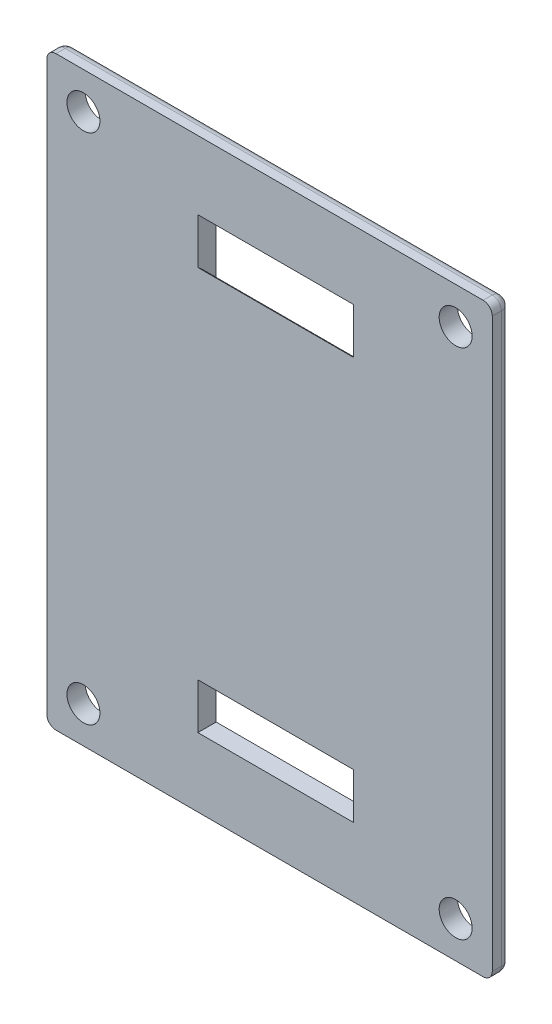
ISO-10303-21;
HEADER;
FILE_DESCRIPTION(('STEP AP214'),'2;1');
FILE_NAME('part.step','',(''),(''),'','','');
FILE_SCHEMA(('AUTOMOTIVE_DESIGN { 1 0 10303 214 1 1 1 1 }'));
ENDSEC;
DATA;
#1=APPLICATION_CONTEXT('core data for automotive mechanical design processes');
#2=APPLICATION_PROTOCOL_DEFINITION('international standard','automotive_design',2000,#1);
#3=PRODUCT_CONTEXT('',#1,'mechanical');
#4=PRODUCT('Part','Part','',(#3));
#5=PRODUCT_RELATED_PRODUCT_CATEGORY('part','',(#4));
#6=PRODUCT_DEFINITION_FORMATION('','',#4);
#7=PRODUCT_DEFINITION_CONTEXT('part definition',#1,'design');
#8=PRODUCT_DEFINITION('design','',#6,#7);
#9=PRODUCT_DEFINITION_SHAPE('','',#8);
#10=(LENGTH_UNIT() NAMED_UNIT(*) SI_UNIT(.MILLI.,.METRE.));
#11=(NAMED_UNIT(*) PLANE_ANGLE_UNIT() SI_UNIT($,.RADIAN.));
#12=(NAMED_UNIT(*) SI_UNIT($,.STERADIAN.) SOLID_ANGLE_UNIT());
#13=UNCERTAINTY_MEASURE_WITH_UNIT(LENGTH_MEASURE(1.E-05),#10,'distance_accuracy_value','');
#14=(GEOMETRIC_REPRESENTATION_CONTEXT(3) GLOBAL_UNCERTAINTY_ASSIGNED_CONTEXT((#13)) GLOBAL_UNIT_ASSIGNED_CONTEXT((#10,
#11,#12)) REPRESENTATION_CONTEXT('',''));
#15=CARTESIAN_POINT('',(0.,0.,0.));
#16=DIRECTION('',(0.,0.,1.));
#17=DIRECTION('',(1.,0.,0.));
#18=AXIS2_PLACEMENT_3D('',#15,#16,#17);
#19=CARTESIAN_POINT('',(10.11616510252,21.944283249802,-18.548286845104));
#20=DIRECTION('',(0.,0.,1.));
#21=DIRECTION('',(1.,0.,0.));
#22=AXIS2_PLACEMENT_3D('',#19,#20,#21);
#23=PLANE('',#22);
#24=CARTESIAN_POINT('',(-10.21433489748,49.944283249802,-18.548286845104));
#25=DIRECTION('',(0.,0.,-1.));
#26=DIRECTION('',(-1.,0.,0.));
#27=AXIS2_PLACEMENT_3D('',#24,#25,#26);
#28=CIRCLE('',#27,1.8);
#29=CARTESIAN_POINT('',(-8.41433489748,49.944283249802,-18.548286845104));
#30=VERTEX_POINT('',#29);
#31=EDGE_CURVE('E55',#30,#30,#28,.T.);
#32=ORIENTED_EDGE('',*,*,#31,.T.);
#33=EDGE_LOOP('',(#32));
#34=FACE_BOUND('',#33,.T.);
#35=CARTESIAN_POINT('',(30.44666510252,49.944283249802,-18.548286845104));
#36=DIRECTION('',(0.,0.,-1.));
#37=DIRECTION('',(-1.,0.,0.));
#38=AXIS2_PLACEMENT_3D('',#35,#36,#37);
#39=CIRCLE('',#38,1.8);
#40=CARTESIAN_POINT('',(32.24666510252,49.944283249802,-18.548286845104));
#41=VERTEX_POINT('',#40);
#42=EDGE_CURVE('E302',#41,#41,#39,.T.);
#43=ORIENTED_EDGE('',*,*,#42,.T.);
#44=EDGE_LOOP('',(#43));
#45=FACE_BOUND('',#44,.T.);
#46=CARTESIAN_POINT('',(-10.21433489748,-6.055716750198,-18.548286845104));
#47=DIRECTION('',(0.,0.,-1.));
#48=DIRECTION('',(-1.,0.,0.));
#49=AXIS2_PLACEMENT_3D('',#46,#47,#48);
#50=CIRCLE('',#49,1.8);
#51=CARTESIAN_POINT('',(-8.41433489748,-6.055716750198,-18.548286845104));
#52=VERTEX_POINT('',#51);
#53=EDGE_CURVE('E375',#52,#52,#50,.T.);
#54=ORIENTED_EDGE('',*,*,#53,.T.);
#55=EDGE_LOOP('',(#54));
#56=FACE_BOUND('',#55,.T.);
#57=CARTESIAN_POINT('',(30.44666510252,-6.055716750198,-18.548286845104));
#58=DIRECTION('',(0.,0.,-1.));
#59=DIRECTION('',(-1.,0.,0.));
#60=AXIS2_PLACEMENT_3D('',#57,#58,#59);
#61=CIRCLE('',#60,1.8);
#62=CARTESIAN_POINT('',(32.24666510252,-6.055716750198,-18.548286845104));
#63=VERTEX_POINT('',#62);
#64=EDGE_CURVE('E416',#63,#63,#61,.T.);
#65=ORIENTED_EDGE('',*,*,#64,.T.);
#66=EDGE_LOOP('',(#65));
#67=FACE_BOUND('',#66,.T.);
#68=DIRECTION('',(-1.,0.,0.));
#69=VECTOR('',#68,1.);
#70=CARTESIAN_POINT('',(6.20091510252,41.4607887528337,-18.548286845104));
#71=LINE('',#70,#69);
#72=CARTESIAN_POINT('',(19.28566510252,41.4607887528337,-18.548286845104));
#73=VERTEX_POINT('',#72);
#74=CARTESIAN_POINT('',(2.28566510252,41.4607887528337,-18.548286845104));
#75=VERTEX_POINT('',#74);
#76=EDGE_CURVE('E368',#73,#75,#71,.T.);
#77=ORIENTED_EDGE('',*,*,#76,.T.);
#78=DIRECTION('',(0.,1.,0.));
#79=VECTOR('',#78,1.);
#80=CARTESIAN_POINT('',(2.28566510252,34.2025360013178,-18.548286845104));
#81=LINE('',#80,#79);
#82=CARTESIAN_POINT('',(2.28566510252,46.4607887528337,-18.548286845104));
#83=VERTEX_POINT('',#82);
#84=EDGE_CURVE('E415',#75,#83,#81,.T.);
#85=ORIENTED_EDGE('',*,*,#84,.T.);
#86=DIRECTION('',(1.,0.,0.));
#87=VECTOR('',#86,1.);
#88=CARTESIAN_POINT('',(14.70091510252,46.4607887528337,-18.548286845104));
#89=LINE('',#88,#87);
#90=CARTESIAN_POINT('',(19.28566510252,46.4607887528337,-18.548286845104));
#91=VERTEX_POINT('',#90);
#92=EDGE_CURVE('E402',#83,#91,#89,.T.);
#93=ORIENTED_EDGE('',*,*,#92,.T.);
#94=DIRECTION('',(0.,-1.,0.));
#95=VECTOR('',#94,1.);
#96=CARTESIAN_POINT('',(19.28566510252,31.7025360013178,-18.548286845104));
#97=LINE('',#96,#95);
#98=EDGE_CURVE('E412',#91,#73,#97,.T.);
#99=ORIENTED_EDGE('',*,*,#98,.T.);
#100=EDGE_LOOP('',(#77,#85,#93,#99));
#101=FACE_BOUND('',#100,.T.);
#102=DIRECTION('',(0.,1.,0.));
#103=VECTOR('',#102,1.);
#104=CARTESIAN_POINT('',(2.28566510252,12.2025360013178,-18.548286845104));
#105=LINE('',#104,#103);
#106=CARTESIAN_POINT('',(2.28566510252,-2.53921124716635,-18.548286845104));
#107=VERTEX_POINT('',#106);
#108=CARTESIAN_POINT('',(2.28566510252,2.4607887528336,-18.548286845104));
#109=VERTEX_POINT('',#108);
#110=EDGE_CURVE('E403',#107,#109,#105,.T.);
#111=ORIENTED_EDGE('',*,*,#110,.T.);
#112=DIRECTION('',(1.,0.,0.));
#113=VECTOR('',#112,1.);
#114=CARTESIAN_POINT('',(14.70091510252,2.4607887528336,-18.548286845104));
#115=LINE('',#114,#113);
#116=CARTESIAN_POINT('',(19.28566510252,2.4607887528336,-18.548286845104));
#117=VERTEX_POINT('',#116);
#118=EDGE_CURVE('E347',#109,#117,#115,.T.);
#119=ORIENTED_EDGE('',*,*,#118,.T.);
#120=DIRECTION('',(0.,-1.,0.));
#121=VECTOR('',#120,1.);
#122=CARTESIAN_POINT('',(19.28566510252,9.7025360013178,-18.548286845104));
#123=LINE('',#122,#121);
#124=CARTESIAN_POINT('',(19.28566510252,-2.53921124716635,-18.548286845104));
#125=VERTEX_POINT('',#124);
#126=EDGE_CURVE('E382',#117,#125,#123,.T.);
#127=ORIENTED_EDGE('',*,*,#126,.T.);
#128=DIRECTION('',(-1.,0.,0.));
#129=VECTOR('',#128,1.);
#130=CARTESIAN_POINT('',(6.20091510252,-2.53921124716635,-18.548286845104));
#131=LINE('',#130,#129);
#132=EDGE_CURVE('E392',#125,#107,#131,.T.);
#133=ORIENTED_EDGE('',*,*,#132,.T.);
#134=EDGE_LOOP('',(#111,#119,#127,#133));
#135=FACE_BOUND('',#134,.T.);
#136=CARTESIAN_POINT('',(-13.21433489748,52.944283249802,-18.548286845104));
#137=DIRECTION('',(0.,0.,-1.));
#138=DIRECTION('',(-0.707106781186549,0.707106781186546,0.));
#139=AXIS2_PLACEMENT_3D('',#136,#137,#138);
#140=CIRCLE('',#139,1.);
#141=CARTESIAN_POINT('',(-14.21433489748,52.944283249802,-18.548286845104));
#142=VERTEX_POINT('',#141);
#143=CARTESIAN_POINT('',(-13.21433489748,53.944283249802,-18.548286845104));
#144=VERTEX_POINT('',#143);
#145=EDGE_CURVE('E445',#142,#144,#140,.T.);
#146=ORIENTED_EDGE('',*,*,#145,.F.);
#147=DIRECTION('',(0.,-1.,0.));
#148=VECTOR('',#147,1.);
#149=CARTESIAN_POINT('',(-14.21433489748,53.944283249802,-18.548286845104));
#150=LINE('',#149,#148);
#151=CARTESIAN_POINT('',(-14.21433489748,-9.055716750198,-18.548286845104));
#152=VERTEX_POINT('',#151);
#153=EDGE_CURVE('E446',#142,#152,#150,.T.);
#154=ORIENTED_EDGE('',*,*,#153,.T.);
#155=CARTESIAN_POINT('',(-13.21433489748,-9.055716750198,-18.548286845104));
#156=DIRECTION('',(0.,0.,-1.));
#157=DIRECTION('',(-0.707106781186547,-0.707106781186548,0.));
#158=AXIS2_PLACEMENT_3D('',#155,#156,#157);
#159=CIRCLE('',#158,1.);
#160=CARTESIAN_POINT('',(-13.21433489748,-10.055716750198,-18.548286845104));
#161=VERTEX_POINT('',#160);
#162=EDGE_CURVE('E360',#161,#152,#159,.T.);
#163=ORIENTED_EDGE('',*,*,#162,.F.);
#164=DIRECTION('',(1.,0.,0.));
#165=VECTOR('',#164,1.);
#166=CARTESIAN_POINT('',(-14.21433489748,-10.055716750198,-18.548286845104));
#167=LINE('',#166,#165);
#168=CARTESIAN_POINT('',(33.44666510252,-10.055716750198,-18.548286845104));
#169=VERTEX_POINT('',#168);
#170=EDGE_CURVE('E352',#161,#169,#167,.T.);
#171=ORIENTED_EDGE('',*,*,#170,.T.);
#172=CARTESIAN_POINT('',(33.44666510252,-9.055716750198,-18.548286845104));
#173=DIRECTION('',(0.,0.,-1.));
#174=DIRECTION('',(0.707106781186546,-0.707106781186549,0.));
#175=AXIS2_PLACEMENT_3D('',#172,#173,#174);
#176=CIRCLE('',#175,1.);
#177=CARTESIAN_POINT('',(34.44666510252,-9.055716750198,-18.548286845104));
#178=VERTEX_POINT('',#177);
#179=EDGE_CURVE('E321',#178,#169,#176,.T.);
#180=ORIENTED_EDGE('',*,*,#179,.F.);
#181=DIRECTION('',(0.,1.,0.));
#182=VECTOR('',#181,1.);
#183=CARTESIAN_POINT('',(34.44666510252,-10.055716750198,-18.548286845104));
#184=LINE('',#183,#182);
#185=CARTESIAN_POINT('',(34.44666510252,52.944283249802,-18.548286845104));
#186=VERTEX_POINT('',#185);
#187=EDGE_CURVE('E314',#178,#186,#184,.T.);
#188=ORIENTED_EDGE('',*,*,#187,.T.);
#189=CARTESIAN_POINT('',(33.44666510252,52.944283249802,-18.548286845104));
#190=DIRECTION('',(0.,0.,-1.));
#191=DIRECTION('',(0.707106781186548,0.707106781186548,0.));
#192=AXIS2_PLACEMENT_3D('',#189,#190,#191);
#193=CIRCLE('',#192,1.);
#194=CARTESIAN_POINT('',(33.44666510252,53.944283249802,-18.548286845104));
#195=VERTEX_POINT('',#194);
#196=EDGE_CURVE('E494',#195,#186,#193,.T.);
#197=ORIENTED_EDGE('',*,*,#196,.F.);
#198=DIRECTION('',(-1.,0.,0.));
#199=VECTOR('',#198,1.);
#200=CARTESIAN_POINT('',(34.44666510252,53.944283249802,-18.548286845104));
#201=LINE('',#200,#199);
#202=EDGE_CURVE('E335',#195,#144,#201,.T.);
#203=ORIENTED_EDGE('',*,*,#202,.T.);
#204=EDGE_LOOP('',(#146,#154,#163,#171,#180,#188,#197,#203));
#205=FACE_BOUND('',#204,.T.);
#206=ADVANCED_FACE('F47',(#34,#45,#56,#67,#101,#135,#205),#23,.T.);
#207=CARTESIAN_POINT('',(-10.21433489748,49.944283249802,-18.548286845104));
#208=DIRECTION('',(0.,0.,-1.));
#209=DIRECTION('',(-1.,0.,0.));
#210=AXIS2_PLACEMENT_3D('',#207,#208,#209);
#211=CYLINDRICAL_SURFACE('',#210,1.8);
#212=ORIENTED_EDGE('',*,*,#31,.F.);
#213=DIRECTION('',(0.,0.,-1.));
#214=VECTOR('',#213,1.);
#215=CARTESIAN_POINT('',(-8.41433489748,49.944283249802,-18.548286845104));
#216=LINE('',#215,#214);
#217=CARTESIAN_POINT('',(-8.41433489748,49.944283249802,-20.548286845104));
#218=VERTEX_POINT('',#217);
#219=EDGE_CURVE('E11',#30,#218,#216,.T.);
#220=ORIENTED_EDGE('',*,*,#219,.T.);
#221=CARTESIAN_POINT('',(-10.21433489748,49.944283249802,-20.548286845104));
#222=DIRECTION('',(0.,0.,1.));
#223=DIRECTION('',(-1.,0.,0.));
#224=AXIS2_PLACEMENT_3D('',#221,#222,#223);
#225=CIRCLE('',#224,1.8);
#226=EDGE_CURVE('E244',#218,#218,#225,.T.);
#227=ORIENTED_EDGE('',*,*,#226,.F.);
#228=ORIENTED_EDGE('',*,*,#219,.F.);
#229=EDGE_LOOP('',(#212,#220,#227,#228));
#230=FACE_BOUND('',#229,.T.);
#231=ADVANCED_FACE('F243',(#230),#211,.F.);
#232=CARTESIAN_POINT('',(30.44666510252,49.944283249802,-18.548286845104));
#233=DIRECTION('',(0.,0.,-1.));
#234=DIRECTION('',(-1.,0.,0.));
#235=AXIS2_PLACEMENT_3D('',#232,#233,#234);
#236=CYLINDRICAL_SURFACE('',#235,1.8);
#237=ORIENTED_EDGE('',*,*,#42,.F.);
#238=DIRECTION('',(0.,0.,-1.));
#239=VECTOR('',#238,1.);
#240=CARTESIAN_POINT('',(32.24666510252,49.944283249802,-18.548286845104));
#241=LINE('',#240,#239);
#242=CARTESIAN_POINT('',(32.24666510252,49.944283249802,-20.548286845104));
#243=VERTEX_POINT('',#242);
#244=EDGE_CURVE('E74',#41,#243,#241,.T.);
#245=ORIENTED_EDGE('',*,*,#244,.T.);
#246=CARTESIAN_POINT('',(30.44666510252,49.944283249802,-20.548286845104));
#247=DIRECTION('',(0.,0.,1.));
#248=DIRECTION('',(-1.,0.,0.));
#249=AXIS2_PLACEMENT_3D('',#246,#247,#248);
#250=CIRCLE('',#249,1.8);
#251=EDGE_CURVE('E249',#243,#243,#250,.T.);
#252=ORIENTED_EDGE('',*,*,#251,.F.);
#253=ORIENTED_EDGE('',*,*,#244,.F.);
#254=EDGE_LOOP('',(#237,#245,#252,#253));
#255=FACE_BOUND('',#254,.T.);
#256=ADVANCED_FACE('F652',(#255),#236,.F.);
#257=CARTESIAN_POINT('',(-10.21433489748,-6.055716750198,-18.548286845104));
#258=DIRECTION('',(0.,0.,-1.));
#259=DIRECTION('',(-1.,0.,0.));
#260=AXIS2_PLACEMENT_3D('',#257,#258,#259);
#261=CYLINDRICAL_SURFACE('',#260,1.8);
#262=ORIENTED_EDGE('',*,*,#53,.F.);
#263=DIRECTION('',(0.,0.,-1.));
#264=VECTOR('',#263,1.);
#265=CARTESIAN_POINT('',(-8.41433489748,-6.055716750198,-18.548286845104));
#266=LINE('',#265,#264);
#267=CARTESIAN_POINT('',(-8.41433489748,-6.055716750198,-20.548286845104));
#268=VERTEX_POINT('',#267);
#269=EDGE_CURVE('E372',#52,#268,#266,.T.);
#270=ORIENTED_EDGE('',*,*,#269,.T.);
#271=CARTESIAN_POINT('',(-10.21433489748,-6.055716750198,-20.548286845104));
#272=DIRECTION('',(0.,0.,1.));
#273=DIRECTION('',(-1.,0.,0.));
#274=AXIS2_PLACEMENT_3D('',#271,#272,#273);
#275=CIRCLE('',#274,1.8);
#276=EDGE_CURVE('E257',#268,#268,#275,.T.);
#277=ORIENTED_EDGE('',*,*,#276,.F.);
#278=ORIENTED_EDGE('',*,*,#269,.F.);
#279=EDGE_LOOP('',(#262,#270,#277,#278));
#280=FACE_BOUND('',#279,.T.);
#281=ADVANCED_FACE('F648',(#280),#261,.F.);
#282=CARTESIAN_POINT('',(30.44666510252,-6.055716750198,-18.548286845104));
#283=DIRECTION('',(0.,0.,-1.));
#284=DIRECTION('',(-1.,0.,0.));
#285=AXIS2_PLACEMENT_3D('',#282,#283,#284);
#286=CYLINDRICAL_SURFACE('',#285,1.8);
#287=ORIENTED_EDGE('',*,*,#64,.F.);
#288=DIRECTION('',(0.,0.,-1.));
#289=VECTOR('',#288,1.);
#290=CARTESIAN_POINT('',(32.24666510252,-6.055716750198,-18.548286845104));
#291=LINE('',#290,#289);
#292=CARTESIAN_POINT('',(32.24666510252,-6.055716750198,-20.548286845104));
#293=VERTEX_POINT('',#292);
#294=EDGE_CURVE('E420',#63,#293,#291,.T.);
#295=ORIENTED_EDGE('',*,*,#294,.T.);
#296=CARTESIAN_POINT('',(30.44666510252,-6.055716750198,-20.548286845104));
#297=DIRECTION('',(0.,0.,1.));
#298=DIRECTION('',(-1.,0.,0.));
#299=AXIS2_PLACEMENT_3D('',#296,#297,#298);
#300=CIRCLE('',#299,1.8);
#301=EDGE_CURVE('E267',#293,#293,#300,.T.);
#302=ORIENTED_EDGE('',*,*,#301,.F.);
#303=ORIENTED_EDGE('',*,*,#294,.F.);
#304=EDGE_LOOP('',(#287,#295,#302,#303));
#305=FACE_BOUND('',#304,.T.);
#306=ADVANCED_FACE('F651',(#305),#286,.F.);
#307=CARTESIAN_POINT('',(2.28566510252,46.4607887528337,-20.548286845104));
#308=DIRECTION('',(-1.,0.,0.));
#309=DIRECTION('',(0.,0.,1.));
#310=AXIS2_PLACEMENT_3D('',#307,#308,#309);
#311=PLANE('',#310);
#312=ORIENTED_EDGE('',*,*,#84,.F.);
#313=CARTESIAN_POINT('',(2.28566510252,37.4607887528336,-15.548286845104));
#314=DIRECTION('',(1.,0.,0.));
#315=DIRECTION('',(0.,0.8,-0.6));
#316=AXIS2_PLACEMENT_3D('',#313,#314,#315);
#317=CIRCLE('',#316,5.);
#318=CARTESIAN_POINT('',(2.28566510252,37.4607887528336,-20.548286845104));
#319=VERTEX_POINT('',#318);
#320=EDGE_CURVE('E364',#319,#75,#317,.T.);
#321=ORIENTED_EDGE('',*,*,#320,.F.);
#322=DIRECTION('',(0.,1.,0.));
#323=VECTOR('',#322,1.);
#324=CARTESIAN_POINT('',(2.28566510252,34.2025360013178,-20.548286845104));
#325=LINE('',#324,#323);
#326=CARTESIAN_POINT('',(2.28566510252,46.4607887528337,-20.548286845104));
#327=VERTEX_POINT('',#326);
#328=EDGE_CURVE('E295',#319,#327,#325,.T.);
#329=ORIENTED_EDGE('',*,*,#328,.T.);
#330=DIRECTION('',(0.,0.,1.));
#331=VECTOR('',#330,1.);
#332=CARTESIAN_POINT('',(2.28566510252,46.4607887528337,-20.548286845104));
#333=LINE('',#332,#331);
#334=EDGE_CURVE('E397',#327,#83,#333,.T.);
#335=ORIENTED_EDGE('',*,*,#334,.T.);
#336=EDGE_LOOP('',(#312,#321,#329,#335));
#337=FACE_BOUND('',#336,.T.);
#338=ADVANCED_FACE('F613',(#337),#311,.F.);
#339=CARTESIAN_POINT('',(19.28566510252,41.4607887528337,-20.548286845104));
#340=DIRECTION('',(1.,0.,0.));
#341=DIRECTION('',(0.,1.,0.));
#342=AXIS2_PLACEMENT_3D('',#339,#340,#341);
#343=PLANE('',#342);
#344=ORIENTED_EDGE('',*,*,#98,.F.);
#345=DIRECTION('',(0.,0.,1.));
#346=VECTOR('',#345,1.);
#347=CARTESIAN_POINT('',(19.28566510252,46.4607887528337,-20.548286845104));
#348=LINE('',#347,#346);
#349=CARTESIAN_POINT('',(19.28566510252,46.4607887528337,-20.548286845104));
#350=VERTEX_POINT('',#349);
#351=EDGE_CURVE('E401',#350,#91,#348,.T.);
#352=ORIENTED_EDGE('',*,*,#351,.F.);
#353=DIRECTION('',(0.,-1.,0.));
#354=VECTOR('',#353,1.);
#355=CARTESIAN_POINT('',(19.28566510252,31.7025360013178,-20.548286845104));
#356=LINE('',#355,#354);
#357=CARTESIAN_POINT('',(19.28566510252,37.4607887528336,-20.548286845104));
#358=VERTEX_POINT('',#357);
#359=EDGE_CURVE('E287',#350,#358,#356,.T.);
#360=ORIENTED_EDGE('',*,*,#359,.T.);
#361=CARTESIAN_POINT('',(19.28566510252,37.4607887528336,-15.548286845104));
#362=DIRECTION('',(1.,0.,0.));
#363=DIRECTION('',(0.,0.8,-0.6));
#364=AXIS2_PLACEMENT_3D('',#361,#362,#363);
#365=CIRCLE('',#364,5.);
#366=EDGE_CURVE('E359',#358,#73,#365,.T.);
#367=ORIENTED_EDGE('',*,*,#366,.T.);
#368=EDGE_LOOP('',(#344,#352,#360,#367));
#369=FACE_BOUND('',#368,.T.);
#370=ADVANCED_FACE('F609',(#369),#343,.F.);
#371=CARTESIAN_POINT('',(19.28566510252,46.4607887528337,-20.548286845104));
#372=DIRECTION('',(0.,1.,0.));
#373=DIRECTION('',(1.,0.,0.));
#374=AXIS2_PLACEMENT_3D('',#371,#372,#373);
#375=PLANE('',#374);
#376=ORIENTED_EDGE('',*,*,#92,.F.);
#377=ORIENTED_EDGE('',*,*,#334,.F.);
#378=DIRECTION('',(-1.,0.,0.));
#379=VECTOR('',#378,1.);
#380=CARTESIAN_POINT('',(14.70091510252,46.4607887528337,-20.548286845104));
#381=LINE('',#380,#379);
#382=EDGE_CURVE('E291',#350,#327,#381,.T.);
#383=ORIENTED_EDGE('',*,*,#382,.F.);
#384=ORIENTED_EDGE('',*,*,#351,.T.);
#385=EDGE_LOOP('',(#376,#377,#383,#384));
#386=FACE_BOUND('',#385,.T.);
#387=ADVANCED_FACE('F612',(#386),#375,.F.);
#388=CARTESIAN_POINT('',(2.28566510252,2.4607887528336,-20.548286845104));
#389=DIRECTION('',(-1.,0.,0.));
#390=DIRECTION('',(0.,0.,1.));
#391=AXIS2_PLACEMENT_3D('',#388,#389,#390);
#392=PLANE('',#391);
#393=ORIENTED_EDGE('',*,*,#110,.F.);
#394=DIRECTION('',(0.,0.,1.));
#395=VECTOR('',#394,1.);
#396=CARTESIAN_POINT('',(2.28566510252,-2.53921124716635,-20.548286845104));
#397=LINE('',#396,#395);
#398=CARTESIAN_POINT('',(2.28566510252,-2.53921124716635,-20.548286845104));
#399=VERTEX_POINT('',#398);
#400=EDGE_CURVE('E396',#399,#107,#397,.T.);
#401=ORIENTED_EDGE('',*,*,#400,.F.);
#402=DIRECTION('',(0.,-1.,0.));
#403=VECTOR('',#402,1.);
#404=CARTESIAN_POINT('',(2.28566510252,12.2025360013178,-20.548286845104));
#405=LINE('',#404,#403);
#406=CARTESIAN_POINT('',(2.28566510252,6.4607887528336,-20.548286845104));
#407=VERTEX_POINT('',#406);
#408=EDGE_CURVE('E271',#407,#399,#405,.T.);
#409=ORIENTED_EDGE('',*,*,#408,.F.);
#410=CARTESIAN_POINT('',(2.28566510252,6.4607887528336,-15.548286845104));
#411=DIRECTION('',(-1.,0.,0.));
#412=DIRECTION('',(0.,-0.8,-0.6));
#413=AXIS2_PLACEMENT_3D('',#410,#411,#412);
#414=CIRCLE('',#413,5.);
#415=EDGE_CURVE('E348',#407,#109,#414,.T.);
#416=ORIENTED_EDGE('',*,*,#415,.T.);
#417=EDGE_LOOP('',(#393,#401,#409,#416));
#418=FACE_BOUND('',#417,.T.);
#419=ADVANCED_FACE('F643',(#418),#392,.F.);
#420=CARTESIAN_POINT('',(2.28566510252,-2.53921124716635,-20.548286845104));
#421=DIRECTION('',(0.,-1.,0.));
#422=DIRECTION('',(0.,0.,-1.));
#423=AXIS2_PLACEMENT_3D('',#420,#421,#422);
#424=PLANE('',#423);
#425=ORIENTED_EDGE('',*,*,#132,.F.);
#426=DIRECTION('',(0.,0.,1.));
#427=VECTOR('',#426,1.);
#428=CARTESIAN_POINT('',(19.28566510252,-2.53921124716635,-20.548286845104));
#429=LINE('',#428,#427);
#430=CARTESIAN_POINT('',(19.28566510252,-2.53921124716635,-20.548286845104));
#431=VERTEX_POINT('',#430);
#432=EDGE_CURVE('E386',#431,#125,#429,.T.);
#433=ORIENTED_EDGE('',*,*,#432,.F.);
#434=DIRECTION('',(1.,0.,0.));
#435=VECTOR('',#434,1.);
#436=CARTESIAN_POINT('',(6.20091510252,-2.53921124716635,-20.548286845104));
#437=LINE('',#436,#435);
#438=EDGE_CURVE('E275',#399,#431,#437,.T.);
#439=ORIENTED_EDGE('',*,*,#438,.F.);
#440=ORIENTED_EDGE('',*,*,#400,.T.);
#441=EDGE_LOOP('',(#425,#433,#439,#440));
#442=FACE_BOUND('',#441,.T.);
#443=ADVANCED_FACE('F639',(#442),#424,.F.);
#444=CARTESIAN_POINT('',(19.28566510252,-2.53921124716635,-20.548286845104));
#445=DIRECTION('',(1.,0.,0.));
#446=DIRECTION('',(0.,1.,0.));
#447=AXIS2_PLACEMENT_3D('',#444,#445,#446);
#448=PLANE('',#447);
#449=ORIENTED_EDGE('',*,*,#126,.F.);
#450=CARTESIAN_POINT('',(19.28566510252,6.4607887528336,-15.548286845104));
#451=DIRECTION('',(-1.,0.,0.));
#452=DIRECTION('',(0.,-0.8,-0.6));
#453=AXIS2_PLACEMENT_3D('',#450,#451,#452);
#454=CIRCLE('',#453,5.);
#455=CARTESIAN_POINT('',(19.28566510252,6.4607887528336,-20.548286845104));
#456=VERTEX_POINT('',#455);
#457=EDGE_CURVE('E343',#456,#117,#454,.T.);
#458=ORIENTED_EDGE('',*,*,#457,.F.);
#459=DIRECTION('',(0.,-1.,0.));
#460=VECTOR('',#459,1.);
#461=CARTESIAN_POINT('',(19.28566510252,9.7025360013178,-20.548286845104));
#462=LINE('',#461,#460);
#463=EDGE_CURVE('E279',#456,#431,#462,.T.);
#464=ORIENTED_EDGE('',*,*,#463,.T.);
#465=ORIENTED_EDGE('',*,*,#432,.T.);
#466=EDGE_LOOP('',(#449,#458,#464,#465));
#467=FACE_BOUND('',#466,.T.);
#468=ADVANCED_FACE('F635',(#467),#448,.F.);
#469=CARTESIAN_POINT('',(14.70091510252,6.4607887528336,-15.548286845104));
#470=DIRECTION('',(1.,0.,0.));
#471=DIRECTION('',(0.,-0.8,-0.6));
#472=AXIS2_PLACEMENT_3D('',#469,#470,#471);
#473=CYLINDRICAL_SURFACE('',#472,5.);
#474=ORIENTED_EDGE('',*,*,#415,.F.);
#475=DIRECTION('',(1.,0.,0.));
#476=VECTOR('',#475,1.);
#477=CARTESIAN_POINT('',(14.70091510252,6.4607887528336,-20.548286845104));
#478=LINE('',#477,#476);
#479=EDGE_CURVE('E283',#407,#456,#478,.T.);
#480=ORIENTED_EDGE('',*,*,#479,.T.);
#481=ORIENTED_EDGE('',*,*,#457,.T.);
#482=ORIENTED_EDGE('',*,*,#118,.F.);
#483=EDGE_LOOP('',(#474,#480,#481,#482));
#484=FACE_BOUND('',#483,.T.);
#485=ADVANCED_FACE('F631',(#484),#473,.T.);
#486=CARTESIAN_POINT('',(6.20091510252,37.4607887528336,-15.548286845104));
#487=DIRECTION('',(-1.,0.,0.));
#488=DIRECTION('',(0.,0.8,-0.6));
#489=AXIS2_PLACEMENT_3D('',#486,#487,#488);
#490=CYLINDRICAL_SURFACE('',#489,5.);
#491=ORIENTED_EDGE('',*,*,#366,.F.);
#492=DIRECTION('',(-1.,0.,0.));
#493=VECTOR('',#492,1.);
#494=CARTESIAN_POINT('',(6.20091510252,37.4607887528336,-20.548286845104));
#495=LINE('',#494,#493);
#496=EDGE_CURVE('E299',#358,#319,#495,.T.);
#497=ORIENTED_EDGE('',*,*,#496,.T.);
#498=ORIENTED_EDGE('',*,*,#320,.T.);
#499=ORIENTED_EDGE('',*,*,#76,.F.);
#500=EDGE_LOOP('',(#491,#497,#498,#499));
#501=FACE_BOUND('',#500,.T.);
#502=ADVANCED_FACE('F628',(#501),#490,.T.);
#503=CARTESIAN_POINT('',(-13.21433489748,-9.055716750198,-19.548286845104));
#504=DIRECTION('',(-0.816496580927726,0.408248290463863,0.408248290463863));
#505=DIRECTION('',(-0.577350269189626,-0.577350269189626,-0.577350269189625));
#506=AXIS2_PLACEMENT_3D('',#503,#504,#505);
#507=SPHERICAL_SURFACE('',#506,1.);
#508=CARTESIAN_POINT('',(-13.21433489748,-9.055716750198,-19.548286845104));
#509=DIRECTION('',(0.,1.,0.));
#510=DIRECTION('',(0.,0.,-1.));
#511=AXIS2_PLACEMENT_3D('',#508,#509,#510);
#512=CIRCLE('',#511,1.);
#513=CARTESIAN_POINT('',(-13.21433489748,-9.055716750198,-20.548286845104));
#514=VERTEX_POINT('',#513);
#515=CARTESIAN_POINT('',(-14.21433489748,-9.055716750198,-19.548286845104));
#516=VERTEX_POINT('',#515);
#517=EDGE_CURVE('E529',#514,#516,#512,.T.);
#518=ORIENTED_EDGE('',*,*,#517,.F.);
#519=CARTESIAN_POINT('',(-13.21433489748,-9.055716750198,-19.548286845104));
#520=DIRECTION('',(-1.,0.,0.));
#521=DIRECTION('',(0.,-0.707106781186548,-0.707106781186547));
#522=AXIS2_PLACEMENT_3D('',#519,#520,#521);
#523=CIRCLE('',#522,1.);
#524=CARTESIAN_POINT('',(-13.21433489748,-10.055716750198,-19.548286845104));
#525=VERTEX_POINT('',#524);
#526=EDGE_CURVE('E342',#514,#525,#523,.T.);
#527=ORIENTED_EDGE('',*,*,#526,.T.);
#528=CARTESIAN_POINT('',(-13.21433489748,-9.055716750198,-19.548286845104));
#529=DIRECTION('',(0.,0.,1.));
#530=DIRECTION('',(-1.,0.,0.));
#531=AXIS2_PLACEMENT_3D('',#528,#529,#530);
#532=CIRCLE('',#531,1.);
#533=EDGE_CURVE('E356',#516,#525,#532,.T.);
#534=ORIENTED_EDGE('',*,*,#533,.F.);
#535=EDGE_LOOP('',(#518,#527,#534));
#536=FACE_BOUND('',#535,.T.);
#537=ADVANCED_FACE('F569',(#536),#507,.T.);
#538=CARTESIAN_POINT('',(-13.21433489748,-9.055716750198,-20.548286845104));
#539=DIRECTION('',(0.,0.,1.));
#540=DIRECTION('',(-0.707106781186547,-0.707106781186548,0.));
#541=AXIS2_PLACEMENT_3D('',#538,#539,#540);
#542=CYLINDRICAL_SURFACE('',#541,1.);
#543=ORIENTED_EDGE('',*,*,#162,.T.);
#544=DIRECTION('',(0.,0.,-1.));
#545=VECTOR('',#544,1.);
#546=CARTESIAN_POINT('',(-14.21433489748,-9.055716750198,-20.548286845104));
#547=LINE('',#546,#545);
#548=EDGE_CURVE('E513',#152,#516,#547,.T.);
#549=ORIENTED_EDGE('',*,*,#548,.T.);
#550=ORIENTED_EDGE('',*,*,#533,.T.);
#551=DIRECTION('',(0.,0.,1.));
#552=VECTOR('',#551,1.);
#553=CARTESIAN_POINT('',(-13.21433489748,-10.055716750198,-20.548286845104));
#554=LINE('',#553,#552);
#555=EDGE_CURVE('E355',#525,#161,#554,.T.);
#556=ORIENTED_EDGE('',*,*,#555,.T.);
#557=EDGE_LOOP('',(#543,#549,#550,#556));
#558=FACE_BOUND('',#557,.T.);
#559=ADVANCED_FACE('F593',(#558),#542,.T.);
#560=CARTESIAN_POINT('',(-14.21433489748,-10.055716750198,-20.548286845104));
#561=DIRECTION('',(0.,-1.,0.));
#562=DIRECTION('',(0.,0.,-1.));
#563=AXIS2_PLACEMENT_3D('',#560,#561,#562);
#564=PLANE('',#563);
#565=DIRECTION('',(0.,0.,-1.));
#566=VECTOR('',#565,1.);
#567=CARTESIAN_POINT('',(33.44666510252,-10.055716750198,-20.548286845104));
#568=LINE('',#567,#566);
#569=CARTESIAN_POINT('',(33.44666510252,-10.055716750198,-19.548286845104));
#570=VERTEX_POINT('',#569);
#571=EDGE_CURVE('E325',#169,#570,#568,.T.);
#572=ORIENTED_EDGE('',*,*,#571,.F.);
#573=ORIENTED_EDGE('',*,*,#170,.F.);
#574=ORIENTED_EDGE('',*,*,#555,.F.);
#575=DIRECTION('',(-1.,0.,0.));
#576=VECTOR('',#575,1.);
#577=CARTESIAN_POINT('',(-2.04908489748,-10.055716750198,-19.548286845104));
#578=LINE('',#577,#576);
#579=EDGE_CURVE('E338',#570,#525,#578,.T.);
#580=ORIENTED_EDGE('',*,*,#579,.F.);
#581=EDGE_LOOP('',(#572,#573,#574,#580));
#582=FACE_BOUND('',#581,.T.);
#583=ADVANCED_FACE('F590',(#582),#564,.T.);
#584=CARTESIAN_POINT('',(-2.04908489748,-9.055716750198,-19.548286845104));
#585=DIRECTION('',(1.,0.,0.));
#586=DIRECTION('',(0.,-0.707106781186548,-0.707106781186547));
#587=AXIS2_PLACEMENT_3D('',#584,#585,#586);
#588=CYLINDRICAL_SURFACE('',#587,1.);
#589=CARTESIAN_POINT('',(33.44666510252,-9.055716750198,-19.548286845104));
#590=DIRECTION('',(1.,0.,0.));
#591=DIRECTION('',(0.,-0.707106781186548,-0.707106781186547));
#592=AXIS2_PLACEMENT_3D('',#589,#590,#591);
#593=CIRCLE('',#592,1.);
#594=CARTESIAN_POINT('',(33.44666510252,-9.055716750198,-20.548286845104));
#595=VERTEX_POINT('',#594);
#596=EDGE_CURVE('E332',#570,#595,#593,.T.);
#597=ORIENTED_EDGE('',*,*,#596,.F.);
#598=ORIENTED_EDGE('',*,*,#579,.T.);
#599=ORIENTED_EDGE('',*,*,#526,.F.);
#600=DIRECTION('',(1.,0.,0.));
#601=VECTOR('',#600,1.);
#602=CARTESIAN_POINT('',(-2.04908489748,-9.055716750198,-20.548286845104));
#603=LINE('',#602,#601);
#604=EDGE_CURVE('E250',#514,#595,#603,.T.);
#605=ORIENTED_EDGE('',*,*,#604,.T.);
#606=EDGE_LOOP('',(#597,#598,#599,#605));
#607=FACE_BOUND('',#606,.T.);
#608=ADVANCED_FACE('F566',(#607),#588,.T.);
#609=CARTESIAN_POINT('',(34.44666510252,53.944283249802,-20.548286845104));
#610=DIRECTION('',(0.,1.,0.));
#611=DIRECTION('',(1.,0.,0.));
#612=AXIS2_PLACEMENT_3D('',#609,#610,#611);
#613=PLANE('',#612);
#614=DIRECTION('',(0.,0.,-1.));
#615=VECTOR('',#614,1.);
#616=CARTESIAN_POINT('',(-13.21433489748,53.944283249802,-20.548286845104));
#617=LINE('',#616,#615);
#618=CARTESIAN_POINT('',(-13.21433489748,53.944283249802,-19.548286845104));
#619=VERTEX_POINT('',#618);
#620=EDGE_CURVE('E454',#144,#619,#617,.T.);
#621=ORIENTED_EDGE('',*,*,#620,.F.);
#622=ORIENTED_EDGE('',*,*,#202,.F.);
#623=DIRECTION('',(0.,0.,1.));
#624=VECTOR('',#623,1.);
#625=CARTESIAN_POINT('',(33.44666510252,53.944283249802,-20.548286845104));
#626=LINE('',#625,#624);
#627=CARTESIAN_POINT('',(33.44666510252,53.944283249802,-19.548286845104));
#628=VERTEX_POINT('',#627);
#629=EDGE_CURVE('E478',#628,#195,#626,.T.);
#630=ORIENTED_EDGE('',*,*,#629,.F.);
#631=DIRECTION('',(1.,0.,0.));
#632=VECTOR('',#631,1.);
#633=CARTESIAN_POINT('',(22.28141510252,53.944283249802,-19.548286845104));
#634=LINE('',#633,#632);
#635=EDGE_CURVE('E465',#619,#628,#634,.T.);
#636=ORIENTED_EDGE('',*,*,#635,.F.);
#637=EDGE_LOOP('',(#621,#622,#630,#636));
#638=FACE_BOUND('',#637,.T.);
#639=ADVANCED_FACE('F552',(#638),#613,.T.);
#640=CARTESIAN_POINT('',(33.44666510252,-9.055716750198,-19.548286845104));
#641=DIRECTION('',(-0.816496580927727,-0.408248290463862,-0.408248290463862));
#642=DIRECTION('',(0.577350269189623,-0.577350269189627,-0.577350269189627));
#643=AXIS2_PLACEMENT_3D('',#640,#641,#642);
#644=SPHERICAL_SURFACE('',#643,1.);
#645=CARTESIAN_POINT('',(33.44666510252,-9.055716750198,-19.548286845104));
#646=DIRECTION('',(0.,0.,1.));
#647=DIRECTION('',(0.,-1.,0.));
#648=AXIS2_PLACEMENT_3D('',#645,#646,#647);
#649=CIRCLE('',#648,1.);
#650=CARTESIAN_POINT('',(34.44666510252,-9.055716750198,-19.548286845104));
#651=VERTEX_POINT('',#650);
#652=EDGE_CURVE('E329',#570,#651,#649,.T.);
#653=ORIENTED_EDGE('',*,*,#652,.F.);
#654=ORIENTED_EDGE('',*,*,#596,.T.);
#655=CARTESIAN_POINT('',(33.44666510252,-9.055716750198,-19.548286845104));
#656=DIRECTION('',(0.,1.,0.));
#657=DIRECTION('',(1.,0.,0.));
#658=AXIS2_PLACEMENT_3D('',#655,#656,#657);
#659=CIRCLE('',#658,1.);
#660=EDGE_CURVE('E310',#651,#595,#659,.T.);
#661=ORIENTED_EDGE('',*,*,#660,.F.);
#662=EDGE_LOOP('',(#653,#654,#661));
#663=FACE_BOUND('',#662,.T.);
#664=ADVANCED_FACE('F563',(#663),#644,.T.);
#665=CARTESIAN_POINT('',(33.44666510252,-9.055716750198,-20.548286845104));
#666=DIRECTION('',(0.,0.,1.));
#667=DIRECTION('',(0.707106781186546,-0.707106781186549,0.));
#668=AXIS2_PLACEMENT_3D('',#665,#666,#667);
#669=CYLINDRICAL_SURFACE('',#668,1.);
#670=ORIENTED_EDGE('',*,*,#179,.T.);
#671=ORIENTED_EDGE('',*,*,#571,.T.);
#672=ORIENTED_EDGE('',*,*,#652,.T.);
#673=DIRECTION('',(0.,0.,1.));
#674=VECTOR('',#673,1.);
#675=CARTESIAN_POINT('',(34.44666510252,-9.055716750198,-20.548286845104));
#676=LINE('',#675,#674);
#677=EDGE_CURVE('E317',#651,#178,#676,.T.);
#678=ORIENTED_EDGE('',*,*,#677,.T.);
#679=EDGE_LOOP('',(#670,#671,#672,#678));
#680=FACE_BOUND('',#679,.T.);
#681=ADVANCED_FACE('F604',(#680),#669,.T.);
#682=CARTESIAN_POINT('',(34.44666510252,-10.055716750198,-20.548286845104));
#683=DIRECTION('',(1.,0.,0.));
#684=DIRECTION('',(0.,1.,0.));
#685=AXIS2_PLACEMENT_3D('',#682,#683,#684);
#686=PLANE('',#685);
#687=DIRECTION('',(0.,0.,-1.));
#688=VECTOR('',#687,1.);
#689=CARTESIAN_POINT('',(34.44666510252,52.944283249802,-20.548286845104));
#690=LINE('',#689,#688);
#691=CARTESIAN_POINT('',(34.44666510252,52.944283249802,-19.548286845104));
#692=VERTEX_POINT('',#691);
#693=EDGE_CURVE('E490',#186,#692,#690,.T.);
#694=ORIENTED_EDGE('',*,*,#693,.F.);
#695=ORIENTED_EDGE('',*,*,#187,.F.);
#696=ORIENTED_EDGE('',*,*,#677,.F.);
#697=DIRECTION('',(0.,-1.,0.));
#698=VECTOR('',#697,1.);
#699=CARTESIAN_POINT('',(34.44666510252,5.944283249802,-19.548286845104));
#700=LINE('',#699,#698);
#701=EDGE_CURVE('E306',#692,#651,#700,.T.);
#702=ORIENTED_EDGE('',*,*,#701,.F.);
#703=EDGE_LOOP('',(#694,#695,#696,#702));
#704=FACE_BOUND('',#703,.T.);
#705=ADVANCED_FACE('F558',(#704),#686,.T.);
#706=CARTESIAN_POINT('',(33.44666510252,5.944283249802,-19.548286845104));
#707=DIRECTION('',(0.,1.,0.));
#708=DIRECTION('',(0.707106781186546,0.,-0.707106781186549));
#709=AXIS2_PLACEMENT_3D('',#706,#707,#708);
#710=CYLINDRICAL_SURFACE('',#709,1.);
#711=CARTESIAN_POINT('',(33.44666510252,52.944283249802,-19.548286845104));
#712=DIRECTION('',(0.,1.,0.));
#713=DIRECTION('',(0.707106781186546,0.,-0.707106781186549));
#714=AXIS2_PLACEMENT_3D('',#711,#712,#713);
#715=CIRCLE('',#714,1.);
#716=CARTESIAN_POINT('',(33.44666510252,52.944283249802,-20.548286845104));
#717=VERTEX_POINT('',#716);
#718=EDGE_CURVE('E482',#692,#717,#715,.T.);
#719=ORIENTED_EDGE('',*,*,#718,.F.);
#720=ORIENTED_EDGE('',*,*,#701,.T.);
#721=ORIENTED_EDGE('',*,*,#660,.T.);
#722=DIRECTION('',(0.,1.,0.));
#723=VECTOR('',#722,1.);
#724=CARTESIAN_POINT('',(33.44666510252,5.944283249802,-20.548286845104));
#725=LINE('',#724,#723);
#726=EDGE_CURVE('E260',#595,#717,#725,.T.);
#727=ORIENTED_EDGE('',*,*,#726,.T.);
#728=EDGE_LOOP('',(#719,#720,#721,#727));
#729=FACE_BOUND('',#728,.T.);
#730=ADVANCED_FACE('F538',(#729),#710,.T.);
#731=CARTESIAN_POINT('',(10.11616510252,21.944283249802,-20.548286845104));
#732=DIRECTION('',(0.,0.,1.));
#733=DIRECTION('',(1.,0.,0.));
#734=AXIS2_PLACEMENT_3D('',#731,#732,#733);
#735=PLANE('',#734);
#736=ORIENTED_EDGE('',*,*,#359,.F.);
#737=ORIENTED_EDGE('',*,*,#382,.T.);
#738=ORIENTED_EDGE('',*,*,#328,.F.);
#739=ORIENTED_EDGE('',*,*,#496,.F.);
#740=EDGE_LOOP('',(#736,#737,#738,#739));
#741=FACE_BOUND('',#740,.T.);
#742=ORIENTED_EDGE('',*,*,#408,.T.);
#743=ORIENTED_EDGE('',*,*,#438,.T.);
#744=ORIENTED_EDGE('',*,*,#463,.F.);
#745=ORIENTED_EDGE('',*,*,#479,.F.);
#746=EDGE_LOOP('',(#742,#743,#744,#745));
#747=FACE_BOUND('',#746,.T.);
#748=ORIENTED_EDGE('',*,*,#301,.T.);
#749=EDGE_LOOP('',(#748));
#750=FACE_BOUND('',#749,.T.);
#751=ORIENTED_EDGE('',*,*,#276,.T.);
#752=EDGE_LOOP('',(#751));
#753=FACE_BOUND('',#752,.T.);
#754=ORIENTED_EDGE('',*,*,#251,.T.);
#755=EDGE_LOOP('',(#754));
#756=FACE_BOUND('',#755,.T.);
#757=ORIENTED_EDGE('',*,*,#226,.T.);
#758=EDGE_LOOP('',(#757));
#759=FACE_BOUND('',#758,.T.);
#760=DIRECTION('',(-1.,0.,0.));
#761=VECTOR('',#760,1.);
#762=CARTESIAN_POINT('',(22.28141510252,52.944283249802,-20.548286845104));
#763=LINE('',#762,#761);
#764=CARTESIAN_POINT('',(-13.21433489748,52.944283249802,-20.548286845104));
#765=VERTEX_POINT('',#764);
#766=EDGE_CURVE('E466',#717,#765,#763,.T.);
#767=ORIENTED_EDGE('',*,*,#766,.F.);
#768=ORIENTED_EDGE('',*,*,#726,.F.);
#769=ORIENTED_EDGE('',*,*,#604,.F.);
#770=DIRECTION('',(0.,-1.,0.));
#771=VECTOR('',#770,1.);
#772=CARTESIAN_POINT('',(-13.21433489748,37.944283249802,-20.548286845104));
#773=LINE('',#772,#771);
#774=EDGE_CURVE('E525',#765,#514,#773,.T.);
#775=ORIENTED_EDGE('',*,*,#774,.F.);
#776=EDGE_LOOP('',(#767,#768,#769,#775));
#777=FACE_BOUND('',#776,.T.);
#778=ADVANCED_FACE('F246',(#741,#747,#750,#753,#756,#759,#777),#735,.F.);
#779=CARTESIAN_POINT('',(-13.21433489748,37.944283249802,-19.548286845104));
#780=DIRECTION('',(0.,-1.,0.));
#781=DIRECTION('',(-0.707106781186548,0.,-0.707106781186547));
#782=AXIS2_PLACEMENT_3D('',#779,#780,#781);
#783=CYLINDRICAL_SURFACE('',#782,1.);
#784=CARTESIAN_POINT('',(-13.21433489748,52.944283249802,-19.548286845104));
#785=DIRECTION('',(0.,1.,0.));
#786=DIRECTION('',(-0.707106781186548,0.,-0.707106781186547));
#787=AXIS2_PLACEMENT_3D('',#784,#785,#786);
#788=CIRCLE('',#787,1.);
#789=CARTESIAN_POINT('',(-14.21433489748,52.944283249802,-19.548286845104));
#790=VERTEX_POINT('',#789);
#791=EDGE_CURVE('E498',#765,#790,#788,.T.);
#792=ORIENTED_EDGE('',*,*,#791,.F.);
#793=ORIENTED_EDGE('',*,*,#774,.T.);
#794=ORIENTED_EDGE('',*,*,#517,.T.);
#795=DIRECTION('',(0.,1.,0.));
#796=VECTOR('',#795,1.);
#797=CARTESIAN_POINT('',(-14.21433489748,37.944283249802,-19.548286845104));
#798=LINE('',#797,#796);
#799=EDGE_CURVE('E510',#516,#790,#798,.T.);
#800=ORIENTED_EDGE('',*,*,#799,.T.);
#801=EDGE_LOOP('',(#792,#793,#794,#800));
#802=FACE_BOUND('',#801,.T.);
#803=ADVANCED_FACE('F571',(#802),#783,.T.);
#804=CARTESIAN_POINT('',(-14.21433489748,53.944283249802,-20.548286845104));
#805=DIRECTION('',(-1.,0.,0.));
#806=DIRECTION('',(0.,0.,1.));
#807=AXIS2_PLACEMENT_3D('',#804,#805,#806);
#808=PLANE('',#807);
#809=DIRECTION('',(0.,0.,1.));
#810=VECTOR('',#809,1.);
#811=CARTESIAN_POINT('',(-14.21433489748,52.944283249802,-20.548286845104));
#812=LINE('',#811,#810);
#813=EDGE_CURVE('E474',#790,#142,#812,.T.);
#814=ORIENTED_EDGE('',*,*,#813,.F.);
#815=ORIENTED_EDGE('',*,*,#799,.F.);
#816=ORIENTED_EDGE('',*,*,#548,.F.);
#817=ORIENTED_EDGE('',*,*,#153,.F.);
#818=EDGE_LOOP('',(#814,#815,#816,#817));
#819=FACE_BOUND('',#818,.T.);
#820=ADVANCED_FACE('F600',(#819),#808,.T.);
#821=CARTESIAN_POINT('',(33.44666510252,52.944283249802,-19.548286845104));
#822=DIRECTION('',(0.40824829046386,-0.816496580927727,-0.408248290463864));
#823=DIRECTION('',(0.577350269189624,0.577350269189624,-0.577350269189629));
#824=AXIS2_PLACEMENT_3D('',#821,#822,#823);
#825=SPHERICAL_SURFACE('',#824,1.);
#826=CARTESIAN_POINT('',(33.44666510252,52.944283249802,-19.548286845104));
#827=DIRECTION('',(0.,0.,1.));
#828=DIRECTION('',(1.,0.,0.));
#829=AXIS2_PLACEMENT_3D('',#826,#827,#828);
#830=CIRCLE('',#829,1.);
#831=EDGE_CURVE('E483',#692,#628,#830,.T.);
#832=ORIENTED_EDGE('',*,*,#831,.F.);
#833=ORIENTED_EDGE('',*,*,#718,.T.);
#834=CARTESIAN_POINT('',(33.44666510252,52.944283249802,-19.548286845104));
#835=DIRECTION('',(-1.,0.,0.));
#836=DIRECTION('',(0.,1.,0.));
#837=AXIS2_PLACEMENT_3D('',#834,#835,#836);
#838=CIRCLE('',#837,1.);
#839=EDGE_CURVE('E486',#628,#717,#838,.T.);
#840=ORIENTED_EDGE('',*,*,#839,.F.);
#841=EDGE_LOOP('',(#832,#833,#840));
#842=FACE_BOUND('',#841,.T.);
#843=ADVANCED_FACE('F545',(#842),#825,.T.);
#844=CARTESIAN_POINT('',(33.44666510252,52.944283249802,-20.548286845104));
#845=DIRECTION('',(0.,0.,1.));
#846=DIRECTION('',(0.707106781186548,0.707106781186548,0.));
#847=AXIS2_PLACEMENT_3D('',#844,#845,#846);
#848=CYLINDRICAL_SURFACE('',#847,1.);
#849=ORIENTED_EDGE('',*,*,#196,.T.);
#850=ORIENTED_EDGE('',*,*,#693,.T.);
#851=ORIENTED_EDGE('',*,*,#831,.T.);
#852=ORIENTED_EDGE('',*,*,#629,.T.);
#853=EDGE_LOOP('',(#849,#850,#851,#852));
#854=FACE_BOUND('',#853,.T.);
#855=ADVANCED_FACE('F554',(#854),#848,.T.);
#856=CARTESIAN_POINT('',(-13.21433489748,52.944283249802,-19.548286845104));
#857=DIRECTION('',(0.408248290463865,-0.40824829046386,-0.816496580927727));
#858=DIRECTION('',(-0.577350269189627,0.577350269189623,-0.577350269189627));
#859=AXIS2_PLACEMENT_3D('',#856,#857,#858);
#860=SPHERICAL_SURFACE('',#859,1.);
#861=CARTESIAN_POINT('',(-13.21433489748,52.944283249802,-19.548286845104));
#862=DIRECTION('',(1.,0.,0.));
#863=DIRECTION('',(0.,0.,-1.));
#864=AXIS2_PLACEMENT_3D('',#861,#862,#863);
#865=CIRCLE('',#864,1.);
#866=EDGE_CURVE('E462',#765,#619,#865,.T.);
#867=ORIENTED_EDGE('',*,*,#866,.F.);
#868=ORIENTED_EDGE('',*,*,#791,.T.);
#869=CARTESIAN_POINT('',(-13.21433489748,52.944283249802,-19.548286845104));
#870=DIRECTION('',(0.,0.,1.));
#871=DIRECTION('',(0.,1.,0.));
#872=AXIS2_PLACEMENT_3D('',#869,#870,#871);
#873=CIRCLE('',#872,1.);
#874=EDGE_CURVE('E459',#619,#790,#873,.T.);
#875=ORIENTED_EDGE('',*,*,#874,.F.);
#876=EDGE_LOOP('',(#867,#868,#875));
#877=FACE_BOUND('',#876,.T.);
#878=ADVANCED_FACE('F575',(#877),#860,.T.);
#879=CARTESIAN_POINT('',(22.28141510252,52.944283249802,-19.548286845104));
#880=DIRECTION('',(-1.,0.,0.));
#881=DIRECTION('',(0.,0.707106781186546,-0.707106781186549));
#882=AXIS2_PLACEMENT_3D('',#879,#880,#881);
#883=CYLINDRICAL_SURFACE('',#882,1.);
#884=ORIENTED_EDGE('',*,*,#839,.T.);
#885=ORIENTED_EDGE('',*,*,#766,.T.);
#886=ORIENTED_EDGE('',*,*,#866,.T.);
#887=ORIENTED_EDGE('',*,*,#635,.T.);
#888=EDGE_LOOP('',(#884,#885,#886,#887));
#889=FACE_BOUND('',#888,.T.);
#890=ADVANCED_FACE('F548',(#889),#883,.T.);
#891=CARTESIAN_POINT('',(-13.21433489748,52.944283249802,-20.548286845104));
#892=DIRECTION('',(0.,0.,1.));
#893=DIRECTION('',(-0.707106781186549,0.707106781186546,0.));
#894=AXIS2_PLACEMENT_3D('',#891,#892,#893);
#895=CYLINDRICAL_SURFACE('',#894,1.);
#896=ORIENTED_EDGE('',*,*,#145,.T.);
#897=ORIENTED_EDGE('',*,*,#620,.T.);
#898=ORIENTED_EDGE('',*,*,#874,.T.);
#899=ORIENTED_EDGE('',*,*,#813,.T.);
#900=EDGE_LOOP('',(#896,#897,#898,#899));
#901=FACE_BOUND('',#900,.T.);
#902=ADVANCED_FACE('F576',(#901),#895,.T.);
#903=CLOSED_SHELL('',(#206,#231,#256,#281,#306,#338,#370,#387,#419,#443,#468,#485,#502,#537,
#559,#583,#608,#639,#664,#681,#705,#730,#778,#803,#820,#843,#855,#878,#890,#902));
#904=MANIFOLD_SOLID_BREP('B2',#903);
#905=ADVANCED_BREP_SHAPE_REPRESENTATION('',(#18,#904),#14);
#906=SHAPE_DEFINITION_REPRESENTATION(#9,#905);
ENDSEC;
END-ISO-10303-21;
